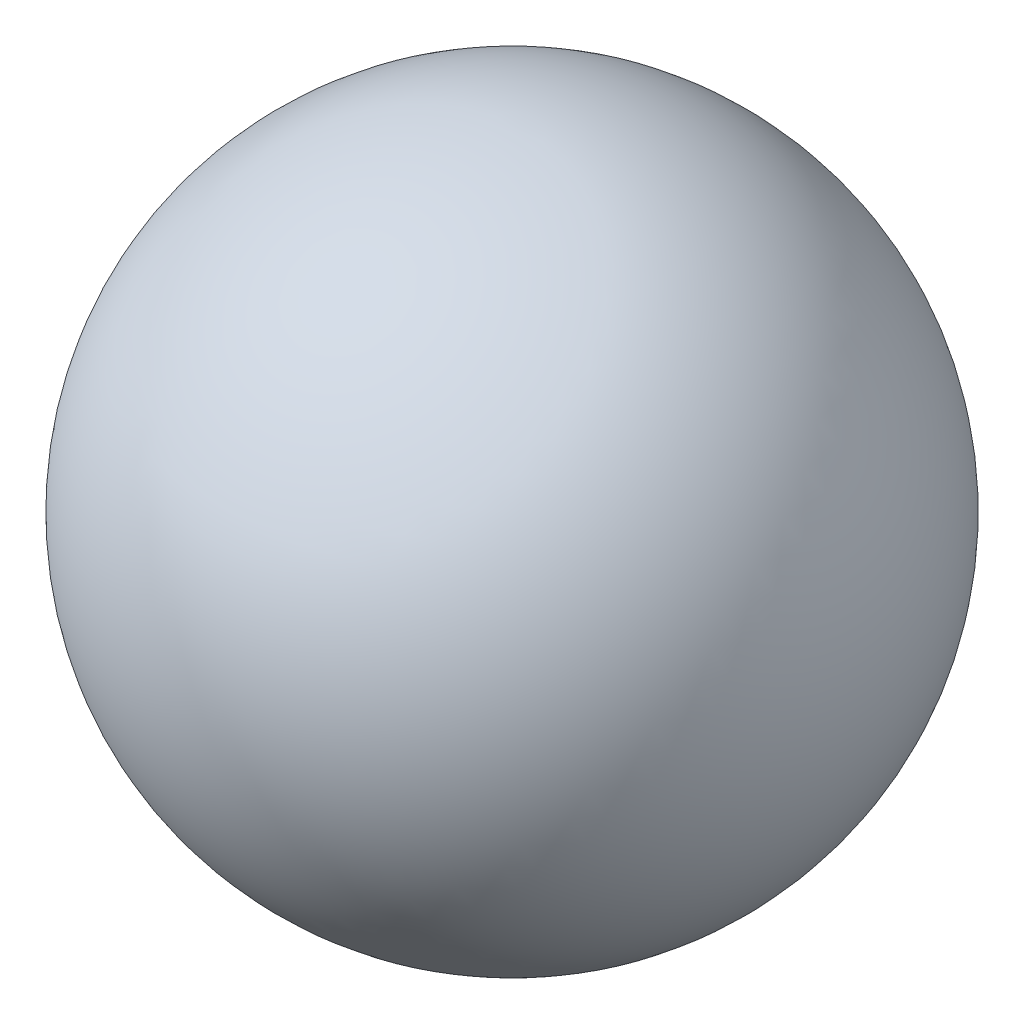
ISO-10303-21;
HEADER;
FILE_DESCRIPTION(('STEP AP214'),'2;1');
FILE_NAME('part.step','',(''),(''),'','','');
FILE_SCHEMA(('AUTOMOTIVE_DESIGN { 1 0 10303 214 1 1 1 1 }'));
ENDSEC;
DATA;
#1=APPLICATION_CONTEXT('core data for automotive mechanical design processes');
#2=APPLICATION_PROTOCOL_DEFINITION('international standard','automotive_design',2000,#1);
#3=PRODUCT_CONTEXT('',#1,'mechanical');
#4=PRODUCT('Part','Part','',(#3));
#5=PRODUCT_RELATED_PRODUCT_CATEGORY('part','',(#4));
#6=PRODUCT_DEFINITION_FORMATION('','',#4);
#7=PRODUCT_DEFINITION_CONTEXT('part definition',#1,'design');
#8=PRODUCT_DEFINITION('design','',#6,#7);
#9=PRODUCT_DEFINITION_SHAPE('','',#8);
#10=(LENGTH_UNIT() NAMED_UNIT(*) SI_UNIT(.MILLI.,.METRE.));
#11=(NAMED_UNIT(*) PLANE_ANGLE_UNIT() SI_UNIT($,.RADIAN.));
#12=(NAMED_UNIT(*) SI_UNIT($,.STERADIAN.) SOLID_ANGLE_UNIT());
#13=UNCERTAINTY_MEASURE_WITH_UNIT(LENGTH_MEASURE(1.E-05),#10,'distance_accuracy_value','');
#14=(GEOMETRIC_REPRESENTATION_CONTEXT(3) GLOBAL_UNCERTAINTY_ASSIGNED_CONTEXT((#13)) GLOBAL_UNIT_ASSIGNED_CONTEXT((#10,
#11,#12)) REPRESENTATION_CONTEXT('',''));
#15=CARTESIAN_POINT('',(0.,0.,0.));
#16=DIRECTION('',(0.,0.,1.));
#17=DIRECTION('',(1.,0.,0.));
#18=AXIS2_PLACEMENT_3D('',#15,#16,#17);
#19=CARTESIAN_POINT('',(0.,0.,0.));
#20=DIRECTION('',(0.,1.,0.));
#21=DIRECTION('',(1.,0.,0.));
#22=AXIS2_PLACEMENT_3D('',#19,#20,#21);
#23=SPHERICAL_SURFACE('',#22,37.5);
#24=CARTESIAN_POINT('',(0.,37.5,0.));
#25=VERTEX_POINT('',#24);
#26=VERTEX_LOOP('',#25);
#27=FACE_BOUND('',#26,.T.);
#28=ADVANCED_FACE('F31',(#27),#23,.T.);
#29=CLOSED_SHELL('',(#28));
#30=MANIFOLD_SOLID_BREP('B2',#29);
#31=ADVANCED_BREP_SHAPE_REPRESENTATION('',(#18,#30),#14);
#32=SHAPE_DEFINITION_REPRESENTATION(#9,#31);
ENDSEC;
END-ISO-10303-21;
